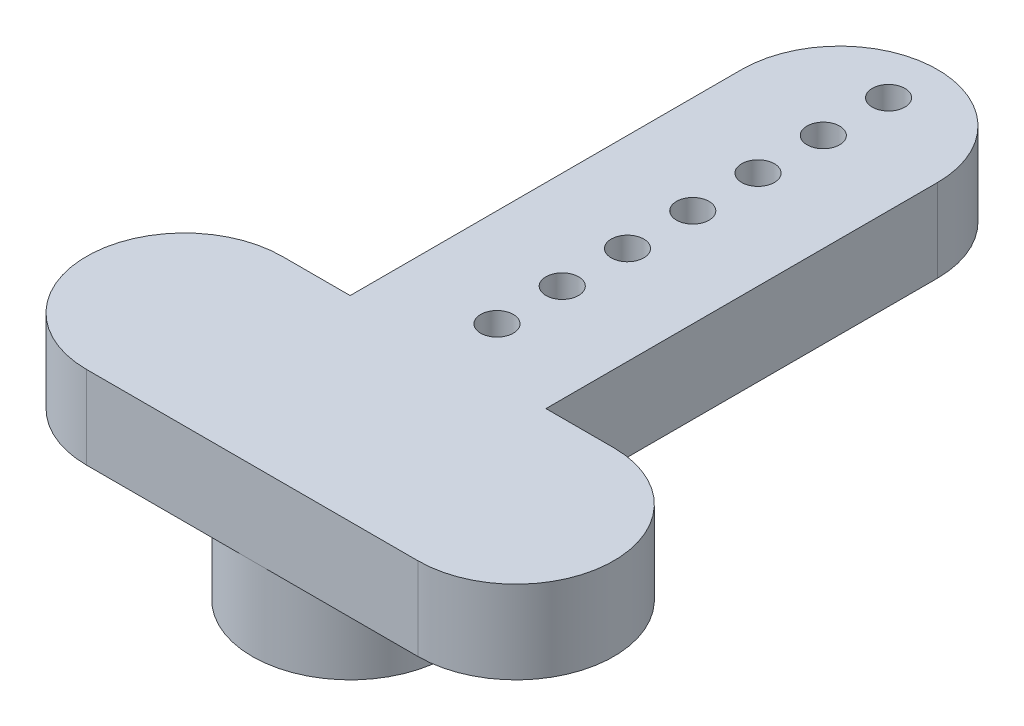
ISO-10303-21;
HEADER;
FILE_DESCRIPTION(('STEP AP214'),'2;1');
FILE_NAME('part.step','',(''),(''),'','','');
FILE_SCHEMA(('AUTOMOTIVE_DESIGN { 1 0 10303 214 1 1 1 1 }'));
ENDSEC;
DATA;
#1=APPLICATION_CONTEXT('core data for automotive mechanical design processes');
#2=APPLICATION_PROTOCOL_DEFINITION('international standard','automotive_design',2000,#1);
#3=PRODUCT_CONTEXT('',#1,'mechanical');
#4=PRODUCT('Part','Part','',(#3));
#5=PRODUCT_RELATED_PRODUCT_CATEGORY('part','',(#4));
#6=PRODUCT_DEFINITION_FORMATION('','',#4);
#7=PRODUCT_DEFINITION_CONTEXT('part definition',#1,'design');
#8=PRODUCT_DEFINITION('design','',#6,#7);
#9=PRODUCT_DEFINITION_SHAPE('','',#8);
#10=(LENGTH_UNIT() NAMED_UNIT(*) SI_UNIT(.MILLI.,.METRE.));
#11=(NAMED_UNIT(*) PLANE_ANGLE_UNIT() SI_UNIT($,.RADIAN.));
#12=(NAMED_UNIT(*) SI_UNIT($,.STERADIAN.) SOLID_ANGLE_UNIT());
#13=UNCERTAINTY_MEASURE_WITH_UNIT(LENGTH_MEASURE(1.E-05),#10,'distance_accuracy_value','');
#14=(GEOMETRIC_REPRESENTATION_CONTEXT(3) GLOBAL_UNCERTAINTY_ASSIGNED_CONTEXT((#13)) GLOBAL_UNIT_ASSIGNED_CONTEXT((#10,
#11,#12)) REPRESENTATION_CONTEXT('',''));
#15=CARTESIAN_POINT('',(0.,0.,0.));
#16=DIRECTION('',(0.,0.,1.));
#17=DIRECTION('',(1.,0.,0.));
#18=AXIS2_PLACEMENT_3D('',#15,#16,#17);
#19=CARTESIAN_POINT('',(0.,2.54,0.));
#20=DIRECTION('',(0.,-1.,0.));
#21=DIRECTION('',(0.,0.,-1.));
#22=AXIS2_PLACEMENT_3D('',#19,#20,#21);
#23=CYLINDRICAL_SURFACE('',#22,3.);
#24=CARTESIAN_POINT('',(0.,2.54,0.));
#25=DIRECTION('',(0.,1.,0.));
#26=DIRECTION('',(0.,0.,1.));
#27=AXIS2_PLACEMENT_3D('',#24,#25,#26);
#28=CIRCLE('',#27,3.);
#29=CARTESIAN_POINT('',(0.,2.54,3.));
#30=VERTEX_POINT('',#29);
#31=EDGE_CURVE('E11',#30,#30,#28,.T.);
#32=ORIENTED_EDGE('',*,*,#31,.F.);
#33=EDGE_LOOP('',(#32));
#34=FACE_BOUND('',#33,.T.);
#35=CARTESIAN_POINT('',(0.,0.,0.));
#36=DIRECTION('',(0.,1.,0.));
#37=DIRECTION('',(0.,0.,1.));
#38=AXIS2_PLACEMENT_3D('',#35,#36,#37);
#39=CIRCLE('',#38,3.);
#40=CARTESIAN_POINT('',(0.,0.,3.));
#41=VERTEX_POINT('',#40);
#42=EDGE_CURVE('E50',#41,#41,#39,.T.);
#43=ORIENTED_EDGE('',*,*,#42,.T.);
#44=EDGE_LOOP('',(#43));
#45=FACE_BOUND('',#44,.T.);
#46=ADVANCED_FACE('F47',(#34,#45),#23,.T.);
#47=CARTESIAN_POINT('',(0.,0.,0.));
#48=DIRECTION('',(0.,1.,0.));
#49=DIRECTION('',(0.,0.,1.));
#50=AXIS2_PLACEMENT_3D('',#47,#48,#49);
#51=PLANE('',#50);
#52=ORIENTED_EDGE('',*,*,#42,.F.);
#53=EDGE_LOOP('',(#52));
#54=FACE_BOUND('',#53,.T.);
#55=ADVANCED_FACE('F207',(#54),#51,.F.);
#56=CARTESIAN_POINT('',(0.,2.54,0.));
#57=DIRECTION('',(0.,1.,0.));
#58=DIRECTION('',(0.,0.,1.));
#59=AXIS2_PLACEMENT_3D('',#56,#57,#58);
#60=PLANE('',#59);
#61=CARTESIAN_POINT('',(0.,2.54,-16.5));
#62=DIRECTION('',(0.,1.,0.));
#63=DIRECTION('',(0.,0.,1.));
#64=AXIS2_PLACEMENT_3D('',#61,#62,#63);
#65=CIRCLE('',#64,0.5);
#66=CARTESIAN_POINT('',(0.,2.54,-16.));
#67=VERTEX_POINT('',#66);
#68=EDGE_CURVE('E157',#67,#67,#65,.T.);
#69=ORIENTED_EDGE('',*,*,#68,.T.);
#70=EDGE_LOOP('',(#69));
#71=FACE_BOUND('',#70,.T.);
#72=CARTESIAN_POINT('',(0.,2.54,-14.5));
#73=DIRECTION('',(0.,1.,0.));
#74=DIRECTION('',(0.,0.,1.));
#75=AXIS2_PLACEMENT_3D('',#72,#73,#74);
#76=CIRCLE('',#75,0.5);
#77=CARTESIAN_POINT('',(0.,2.54,-14.));
#78=VERTEX_POINT('',#77);
#79=EDGE_CURVE('E281',#78,#78,#76,.T.);
#80=ORIENTED_EDGE('',*,*,#79,.T.);
#81=EDGE_LOOP('',(#80));
#82=FACE_BOUND('',#81,.T.);
#83=CARTESIAN_POINT('',(0.,2.54,-12.5));
#84=DIRECTION('',(0.,1.,0.));
#85=DIRECTION('',(0.,0.,1.));
#86=AXIS2_PLACEMENT_3D('',#83,#84,#85);
#87=CIRCLE('',#86,0.5);
#88=CARTESIAN_POINT('',(0.,2.54,-12.));
#89=VERTEX_POINT('',#88);
#90=EDGE_CURVE('E285',#89,#89,#87,.T.);
#91=ORIENTED_EDGE('',*,*,#90,.T.);
#92=EDGE_LOOP('',(#91));
#93=FACE_BOUND('',#92,.T.);
#94=CARTESIAN_POINT('',(0.,2.54,-10.5));
#95=DIRECTION('',(0.,1.,0.));
#96=DIRECTION('',(0.,0.,1.));
#97=AXIS2_PLACEMENT_3D('',#94,#95,#96);
#98=CIRCLE('',#97,0.5);
#99=CARTESIAN_POINT('',(0.,2.54,-10.));
#100=VERTEX_POINT('',#99);
#101=EDGE_CURVE('E313',#100,#100,#98,.T.);
#102=ORIENTED_EDGE('',*,*,#101,.T.);
#103=EDGE_LOOP('',(#102));
#104=FACE_BOUND('',#103,.T.);
#105=CARTESIAN_POINT('',(0.,2.54,-8.5));
#106=DIRECTION('',(0.,1.,0.));
#107=DIRECTION('',(0.,0.,1.));
#108=AXIS2_PLACEMENT_3D('',#105,#106,#107);
#109=CIRCLE('',#108,0.5);
#110=CARTESIAN_POINT('',(0.,2.54,-8.));
#111=VERTEX_POINT('',#110);
#112=EDGE_CURVE('E317',#111,#111,#109,.T.);
#113=ORIENTED_EDGE('',*,*,#112,.T.);
#114=EDGE_LOOP('',(#113));
#115=FACE_BOUND('',#114,.T.);
#116=CARTESIAN_POINT('',(0.,2.54,-6.5));
#117=DIRECTION('',(0.,1.,0.));
#118=DIRECTION('',(0.,0.,1.));
#119=AXIS2_PLACEMENT_3D('',#116,#117,#118);
#120=CIRCLE('',#119,0.5);
#121=CARTESIAN_POINT('',(0.,2.54,-6.));
#122=VERTEX_POINT('',#121);
#123=EDGE_CURVE('E321',#122,#122,#120,.T.);
#124=ORIENTED_EDGE('',*,*,#123,.T.);
#125=EDGE_LOOP('',(#124));
#126=FACE_BOUND('',#125,.T.);
#127=CARTESIAN_POINT('',(0.,2.54,-4.5));
#128=DIRECTION('',(0.,1.,0.));
#129=DIRECTION('',(0.,0.,1.));
#130=AXIS2_PLACEMENT_3D('',#127,#128,#129);
#131=CIRCLE('',#130,0.5);
#132=CARTESIAN_POINT('',(0.,2.54,-4.));
#133=VERTEX_POINT('',#132);
#134=EDGE_CURVE('E325',#133,#133,#131,.T.);
#135=ORIENTED_EDGE('',*,*,#134,.T.);
#136=EDGE_LOOP('',(#135));
#137=FACE_BOUND('',#136,.T.);
#138=DIRECTION('',(1.,0.,0.));
#139=VECTOR('',#138,1.);
#140=CARTESIAN_POINT('',(0.,2.54,3.));
#141=LINE('',#140,#139);
#142=CARTESIAN_POINT('',(5.08,2.54,3.));
#143=VERTEX_POINT('',#142);
#144=EDGE_CURVE('E175',#30,#143,#141,.T.);
#145=ORIENTED_EDGE('',*,*,#144,.F.);
#146=ORIENTED_EDGE('',*,*,#31,.T.);
#147=CARTESIAN_POINT('',(-5.08,2.54,3.));
#148=VERTEX_POINT('',#147);
#149=EDGE_CURVE('E176',#148,#30,#141,.T.);
#150=ORIENTED_EDGE('',*,*,#149,.F.);
#151=CARTESIAN_POINT('',(-5.08,2.54,0.));
#152=DIRECTION('',(0.,1.,0.));
#153=DIRECTION('',(0.,0.,1.));
#154=AXIS2_PLACEMENT_3D('',#151,#152,#153);
#155=CIRCLE('',#154,3.);
#156=CARTESIAN_POINT('',(-5.08,2.54,-3.));
#157=VERTEX_POINT('',#156);
#158=EDGE_CURVE('E136',#157,#148,#155,.T.);
#159=ORIENTED_EDGE('',*,*,#158,.F.);
#160=DIRECTION('',(1.,0.,0.));
#161=VECTOR('',#160,1.);
#162=CARTESIAN_POINT('',(0.,2.54,-3.));
#163=LINE('',#162,#161);
#164=CARTESIAN_POINT('',(-3.,2.54,-3.));
#165=VERTEX_POINT('',#164);
#166=EDGE_CURVE('E169',#157,#165,#163,.T.);
#167=ORIENTED_EDGE('',*,*,#166,.T.);
#168=DIRECTION('',(0.,0.,-1.));
#169=VECTOR('',#168,1.);
#170=CARTESIAN_POINT('',(-3.,2.54,0.));
#171=LINE('',#170,#169);
#172=CARTESIAN_POINT('',(-3.,2.54,-15.));
#173=VERTEX_POINT('',#172);
#174=EDGE_CURVE('E165',#165,#173,#171,.T.);
#175=ORIENTED_EDGE('',*,*,#174,.T.);
#176=CARTESIAN_POINT('',(0.,2.54,-15.));
#177=DIRECTION('',(0.,1.,0.));
#178=DIRECTION('',(0.,0.,1.));
#179=AXIS2_PLACEMENT_3D('',#176,#177,#178);
#180=CIRCLE('',#179,3.);
#181=CARTESIAN_POINT('',(3.,2.54,-15.));
#182=VERTEX_POINT('',#181);
#183=EDGE_CURVE('E161',#173,#182,#180,.F.);
#184=ORIENTED_EDGE('',*,*,#183,.T.);
#185=DIRECTION('',(0.,0.,-1.));
#186=VECTOR('',#185,1.);
#187=CARTESIAN_POINT('',(3.,2.54,0.));
#188=LINE('',#187,#186);
#189=CARTESIAN_POINT('',(3.,2.54,-3.));
#190=VERTEX_POINT('',#189);
#191=EDGE_CURVE('E156',#190,#182,#188,.T.);
#192=ORIENTED_EDGE('',*,*,#191,.F.);
#193=DIRECTION('',(1.,0.,0.));
#194=VECTOR('',#193,1.);
#195=CARTESIAN_POINT('',(0.,2.54,-3.));
#196=LINE('',#195,#194);
#197=CARTESIAN_POINT('',(5.08,2.54,-3.));
#198=VERTEX_POINT('',#197);
#199=EDGE_CURVE('E153',#190,#198,#196,.T.);
#200=ORIENTED_EDGE('',*,*,#199,.T.);
#201=CARTESIAN_POINT('',(5.08,2.54,0.));
#202=DIRECTION('',(0.,1.,0.));
#203=DIRECTION('',(0.,0.,1.));
#204=AXIS2_PLACEMENT_3D('',#201,#202,#203);
#205=CIRCLE('',#204,3.);
#206=EDGE_CURVE('E179',#198,#143,#205,.F.);
#207=ORIENTED_EDGE('',*,*,#206,.T.);
#208=EDGE_LOOP('',(#145,#146,#150,#159,#167,#175,#184,#192,#200,#207));
#209=FACE_BOUND('',#208,.T.);
#210=ADVANCED_FACE('F209',(#71,#82,#93,#104,#115,#126,#137,#209),#60,.F.);
#211=CARTESIAN_POINT('',(0.,5.08,-3.));
#212=DIRECTION('',(0.,0.,-1.));
#213=DIRECTION('',(-1.,0.,0.));
#214=AXIS2_PLACEMENT_3D('',#211,#212,#213);
#215=PLANE('',#214);
#216=ORIENTED_EDGE('',*,*,#199,.F.);
#217=DIRECTION('',(0.,-1.,0.));
#218=VECTOR('',#217,1.);
#219=CARTESIAN_POINT('',(3.,5.08,-3.));
#220=LINE('',#219,#218);
#221=CARTESIAN_POINT('',(3.,5.08,-3.));
#222=VERTEX_POINT('',#221);
#223=EDGE_CURVE('E101',#222,#190,#220,.T.);
#224=ORIENTED_EDGE('',*,*,#223,.F.);
#225=DIRECTION('',(1.,0.,0.));
#226=VECTOR('',#225,1.);
#227=CARTESIAN_POINT('',(0.,5.08,-3.));
#228=LINE('',#227,#226);
#229=CARTESIAN_POINT('',(5.08,5.08,-3.));
#230=VERTEX_POINT('',#229);
#231=EDGE_CURVE('E183',#222,#230,#228,.T.);
#232=ORIENTED_EDGE('',*,*,#231,.T.);
#233=DIRECTION('',(0.,-1.,0.));
#234=VECTOR('',#233,1.);
#235=CARTESIAN_POINT('',(5.08,5.08,-3.));
#236=LINE('',#235,#234);
#237=EDGE_CURVE('E66',#230,#198,#236,.T.);
#238=ORIENTED_EDGE('',*,*,#237,.T.);
#239=EDGE_LOOP('',(#216,#224,#232,#238));
#240=FACE_BOUND('',#239,.T.);
#241=ADVANCED_FACE('F214',(#240),#215,.T.);
#242=CARTESIAN_POINT('',(3.,5.08,0.));
#243=DIRECTION('',(-1.,0.,0.));
#244=DIRECTION('',(0.,0.,1.));
#245=AXIS2_PLACEMENT_3D('',#242,#243,#244);
#246=PLANE('',#245);
#247=ORIENTED_EDGE('',*,*,#191,.T.);
#248=DIRECTION('',(0.,-1.,0.));
#249=VECTOR('',#248,1.);
#250=CARTESIAN_POINT('',(3.,5.08,-15.));
#251=LINE('',#250,#249);
#252=CARTESIAN_POINT('',(3.,5.08,-15.));
#253=VERTEX_POINT('',#252);
#254=EDGE_CURVE('E196',#253,#182,#251,.T.);
#255=ORIENTED_EDGE('',*,*,#254,.F.);
#256=DIRECTION('',(0.,0.,-1.));
#257=VECTOR('',#256,1.);
#258=CARTESIAN_POINT('',(3.,5.08,0.));
#259=LINE('',#258,#257);
#260=EDGE_CURVE('E291',#222,#253,#259,.T.);
#261=ORIENTED_EDGE('',*,*,#260,.F.);
#262=ORIENTED_EDGE('',*,*,#223,.T.);
#263=EDGE_LOOP('',(#247,#255,#261,#262));
#264=FACE_BOUND('',#263,.T.);
#265=ADVANCED_FACE('F220',(#264),#246,.F.);
#266=CARTESIAN_POINT('',(0.,5.08,-15.));
#267=DIRECTION('',(0.,-1.,0.));
#268=DIRECTION('',(0.,0.,-1.));
#269=AXIS2_PLACEMENT_3D('',#266,#267,#268);
#270=CYLINDRICAL_SURFACE('',#269,3.);
#271=ORIENTED_EDGE('',*,*,#183,.F.);
#272=DIRECTION('',(0.,-1.,0.));
#273=VECTOR('',#272,1.);
#274=CARTESIAN_POINT('',(-3.,5.08,-15.));
#275=LINE('',#274,#273);
#276=CARTESIAN_POINT('',(-3.,5.08,-15.));
#277=VERTEX_POINT('',#276);
#278=EDGE_CURVE('E193',#277,#173,#275,.T.);
#279=ORIENTED_EDGE('',*,*,#278,.F.);
#280=CARTESIAN_POINT('',(0.,5.08,-15.));
#281=DIRECTION('',(0.,1.,0.));
#282=DIRECTION('',(0.,0.,1.));
#283=AXIS2_PLACEMENT_3D('',#280,#281,#282);
#284=CIRCLE('',#283,3.);
#285=EDGE_CURVE('E294',#277,#253,#284,.F.);
#286=ORIENTED_EDGE('',*,*,#285,.T.);
#287=ORIENTED_EDGE('',*,*,#254,.T.);
#288=EDGE_LOOP('',(#271,#279,#286,#287));
#289=FACE_BOUND('',#288,.T.);
#290=ADVANCED_FACE('F223',(#289),#270,.T.);
#291=CARTESIAN_POINT('',(-3.,5.08,0.));
#292=DIRECTION('',(-1.,0.,0.));
#293=DIRECTION('',(0.,0.,1.));
#294=AXIS2_PLACEMENT_3D('',#291,#292,#293);
#295=PLANE('',#294);
#296=ORIENTED_EDGE('',*,*,#174,.F.);
#297=DIRECTION('',(0.,-1.,0.));
#298=VECTOR('',#297,1.);
#299=CARTESIAN_POINT('',(-3.,5.08,-3.));
#300=LINE('',#299,#298);
#301=CARTESIAN_POINT('',(-3.,5.08,-3.));
#302=VERTEX_POINT('',#301);
#303=EDGE_CURVE('E190',#302,#165,#300,.T.);
#304=ORIENTED_EDGE('',*,*,#303,.F.);
#305=DIRECTION('',(0.,0.,-1.));
#306=VECTOR('',#305,1.);
#307=CARTESIAN_POINT('',(-3.,5.08,0.));
#308=LINE('',#307,#306);
#309=EDGE_CURVE('E298',#302,#277,#308,.T.);
#310=ORIENTED_EDGE('',*,*,#309,.T.);
#311=ORIENTED_EDGE('',*,*,#278,.T.);
#312=EDGE_LOOP('',(#296,#304,#310,#311));
#313=FACE_BOUND('',#312,.T.);
#314=ADVANCED_FACE('F226',(#313),#295,.T.);
#315=CARTESIAN_POINT('',(0.,5.08,-3.));
#316=DIRECTION('',(0.,0.,-1.));
#317=DIRECTION('',(-1.,0.,0.));
#318=AXIS2_PLACEMENT_3D('',#315,#316,#317);
#319=PLANE('',#318);
#320=ORIENTED_EDGE('',*,*,#166,.F.);
#321=DIRECTION('',(0.,-1.,0.));
#322=VECTOR('',#321,1.);
#323=CARTESIAN_POINT('',(-5.08,5.08,-3.));
#324=LINE('',#323,#322);
#325=CARTESIAN_POINT('',(-5.08,5.08,-3.));
#326=VERTEX_POINT('',#325);
#327=EDGE_CURVE('E141',#326,#157,#324,.T.);
#328=ORIENTED_EDGE('',*,*,#327,.F.);
#329=DIRECTION('',(1.,0.,0.));
#330=VECTOR('',#329,1.);
#331=CARTESIAN_POINT('',(0.,5.08,-3.));
#332=LINE('',#331,#330);
#333=EDGE_CURVE('E128',#326,#302,#332,.T.);
#334=ORIENTED_EDGE('',*,*,#333,.T.);
#335=ORIENTED_EDGE('',*,*,#303,.T.);
#336=EDGE_LOOP('',(#320,#328,#334,#335));
#337=FACE_BOUND('',#336,.T.);
#338=ADVANCED_FACE('F230',(#337),#319,.T.);
#339=CARTESIAN_POINT('',(-5.08,5.08,0.));
#340=DIRECTION('',(0.,-1.,0.));
#341=DIRECTION('',(0.,0.,-1.));
#342=AXIS2_PLACEMENT_3D('',#339,#340,#341);
#343=CYLINDRICAL_SURFACE('',#342,3.);
#344=ORIENTED_EDGE('',*,*,#158,.T.);
#345=DIRECTION('',(0.,-1.,0.));
#346=VECTOR('',#345,1.);
#347=CARTESIAN_POINT('',(-5.08,5.08,3.));
#348=LINE('',#347,#346);
#349=CARTESIAN_POINT('',(-5.08,5.08,3.));
#350=VERTEX_POINT('',#349);
#351=EDGE_CURVE('E133',#350,#148,#348,.T.);
#352=ORIENTED_EDGE('',*,*,#351,.F.);
#353=CARTESIAN_POINT('',(-5.08,5.08,0.));
#354=DIRECTION('',(0.,1.,0.));
#355=DIRECTION('',(0.,0.,1.));
#356=AXIS2_PLACEMENT_3D('',#353,#354,#355);
#357=CIRCLE('',#356,3.);
#358=EDGE_CURVE('E118',#326,#350,#357,.T.);
#359=ORIENTED_EDGE('',*,*,#358,.F.);
#360=ORIENTED_EDGE('',*,*,#327,.T.);
#361=EDGE_LOOP('',(#344,#352,#359,#360));
#362=FACE_BOUND('',#361,.T.);
#363=ADVANCED_FACE('F134',(#362),#343,.T.);
#364=CARTESIAN_POINT('',(0.,5.08,3.));
#365=DIRECTION('',(0.,0.,-1.));
#366=DIRECTION('',(-1.,0.,0.));
#367=AXIS2_PLACEMENT_3D('',#364,#365,#366);
#368=PLANE('',#367);
#369=ORIENTED_EDGE('',*,*,#149,.T.);
#370=ORIENTED_EDGE('',*,*,#144,.T.);
#371=DIRECTION('',(0.,-1.,0.));
#372=VECTOR('',#371,1.);
#373=CARTESIAN_POINT('',(5.08,5.08,3.));
#374=LINE('',#373,#372);
#375=CARTESIAN_POINT('',(5.08,5.08,3.));
#376=VERTEX_POINT('',#375);
#377=EDGE_CURVE('E142',#376,#143,#374,.T.);
#378=ORIENTED_EDGE('',*,*,#377,.F.);
#379=DIRECTION('',(1.,0.,0.));
#380=VECTOR('',#379,1.);
#381=CARTESIAN_POINT('',(0.,5.08,3.));
#382=LINE('',#381,#380);
#383=EDGE_CURVE('E124',#350,#376,#382,.T.);
#384=ORIENTED_EDGE('',*,*,#383,.F.);
#385=ORIENTED_EDGE('',*,*,#351,.T.);
#386=EDGE_LOOP('',(#369,#370,#378,#384,#385));
#387=FACE_BOUND('',#386,.T.);
#388=ADVANCED_FACE('F144',(#387),#368,.F.);
#389=CARTESIAN_POINT('',(5.08,5.08,0.));
#390=DIRECTION('',(0.,-1.,0.));
#391=DIRECTION('',(0.,0.,-1.));
#392=AXIS2_PLACEMENT_3D('',#389,#390,#391);
#393=CYLINDRICAL_SURFACE('',#392,3.);
#394=ORIENTED_EDGE('',*,*,#206,.F.);
#395=ORIENTED_EDGE('',*,*,#237,.F.);
#396=CARTESIAN_POINT('',(5.08,5.08,0.));
#397=DIRECTION('',(0.,1.,0.));
#398=DIRECTION('',(0.,0.,1.));
#399=AXIS2_PLACEMENT_3D('',#396,#397,#398);
#400=CIRCLE('',#399,3.);
#401=EDGE_CURVE('E147',#230,#376,#400,.F.);
#402=ORIENTED_EDGE('',*,*,#401,.T.);
#403=ORIENTED_EDGE('',*,*,#377,.T.);
#404=EDGE_LOOP('',(#394,#395,#402,#403));
#405=FACE_BOUND('',#404,.T.);
#406=ADVANCED_FACE('F239',(#405),#393,.T.);
#407=CARTESIAN_POINT('',(0.,5.08,0.));
#408=DIRECTION('',(0.,1.,0.));
#409=DIRECTION('',(0.,0.,1.));
#410=AXIS2_PLACEMENT_3D('',#407,#408,#409);
#411=PLANE('',#410);
#412=CARTESIAN_POINT('',(0.,5.08,-16.5));
#413=DIRECTION('',(0.,1.,0.));
#414=DIRECTION('',(0.,0.,1.));
#415=AXIS2_PLACEMENT_3D('',#412,#413,#414);
#416=CIRCLE('',#415,0.5);
#417=CARTESIAN_POINT('',(0.,5.08,-16.));
#418=VERTEX_POINT('',#417);
#419=EDGE_CURVE('E277',#418,#418,#416,.T.);
#420=ORIENTED_EDGE('',*,*,#419,.F.);
#421=EDGE_LOOP('',(#420));
#422=FACE_BOUND('',#421,.T.);
#423=CARTESIAN_POINT('',(0.,5.08,-14.5));
#424=DIRECTION('',(0.,1.,0.));
#425=DIRECTION('',(0.,0.,1.));
#426=AXIS2_PLACEMENT_3D('',#423,#424,#425);
#427=CIRCLE('',#426,0.5);
#428=CARTESIAN_POINT('',(0.,5.08,-14.));
#429=VERTEX_POINT('',#428);
#430=EDGE_CURVE('E349',#429,#429,#427,.T.);
#431=ORIENTED_EDGE('',*,*,#430,.F.);
#432=EDGE_LOOP('',(#431));
#433=FACE_BOUND('',#432,.T.);
#434=CARTESIAN_POINT('',(0.,5.08,-12.5));
#435=DIRECTION('',(0.,1.,0.));
#436=DIRECTION('',(0.,0.,1.));
#437=AXIS2_PLACEMENT_3D('',#434,#435,#436);
#438=CIRCLE('',#437,0.5);
#439=CARTESIAN_POINT('',(0.,5.08,-12.));
#440=VERTEX_POINT('',#439);
#441=EDGE_CURVE('E345',#440,#440,#438,.T.);
#442=ORIENTED_EDGE('',*,*,#441,.F.);
#443=EDGE_LOOP('',(#442));
#444=FACE_BOUND('',#443,.T.);
#445=CARTESIAN_POINT('',(0.,5.08,-10.5));
#446=DIRECTION('',(0.,1.,0.));
#447=DIRECTION('',(0.,0.,1.));
#448=AXIS2_PLACEMENT_3D('',#445,#446,#447);
#449=CIRCLE('',#448,0.5);
#450=CARTESIAN_POINT('',(0.,5.08,-10.));
#451=VERTEX_POINT('',#450);
#452=EDGE_CURVE('E341',#451,#451,#449,.T.);
#453=ORIENTED_EDGE('',*,*,#452,.F.);
#454=EDGE_LOOP('',(#453));
#455=FACE_BOUND('',#454,.T.);
#456=CARTESIAN_POINT('',(0.,5.08,-8.5));
#457=DIRECTION('',(0.,1.,0.));
#458=DIRECTION('',(0.,0.,1.));
#459=AXIS2_PLACEMENT_3D('',#456,#457,#458);
#460=CIRCLE('',#459,0.5);
#461=CARTESIAN_POINT('',(0.,5.08,-8.));
#462=VERTEX_POINT('',#461);
#463=EDGE_CURVE('E337',#462,#462,#460,.T.);
#464=ORIENTED_EDGE('',*,*,#463,.F.);
#465=EDGE_LOOP('',(#464));
#466=FACE_BOUND('',#465,.T.);
#467=CARTESIAN_POINT('',(0.,5.08,-6.5));
#468=DIRECTION('',(0.,1.,0.));
#469=DIRECTION('',(0.,0.,1.));
#470=AXIS2_PLACEMENT_3D('',#467,#468,#469);
#471=CIRCLE('',#470,0.5);
#472=CARTESIAN_POINT('',(0.,5.08,-6.));
#473=VERTEX_POINT('',#472);
#474=EDGE_CURVE('E333',#473,#473,#471,.T.);
#475=ORIENTED_EDGE('',*,*,#474,.F.);
#476=EDGE_LOOP('',(#475));
#477=FACE_BOUND('',#476,.T.);
#478=CARTESIAN_POINT('',(0.,5.08,-4.5));
#479=DIRECTION('',(0.,1.,0.));
#480=DIRECTION('',(0.,0.,1.));
#481=AXIS2_PLACEMENT_3D('',#478,#479,#480);
#482=CIRCLE('',#481,0.5);
#483=CARTESIAN_POINT('',(0.,5.08,-4.));
#484=VERTEX_POINT('',#483);
#485=EDGE_CURVE('E329',#484,#484,#482,.T.);
#486=ORIENTED_EDGE('',*,*,#485,.F.);
#487=EDGE_LOOP('',(#486));
#488=FACE_BOUND('',#487,.T.);
#489=ORIENTED_EDGE('',*,*,#231,.F.);
#490=ORIENTED_EDGE('',*,*,#260,.T.);
#491=ORIENTED_EDGE('',*,*,#285,.F.);
#492=ORIENTED_EDGE('',*,*,#309,.F.);
#493=ORIENTED_EDGE('',*,*,#333,.F.);
#494=ORIENTED_EDGE('',*,*,#358,.T.);
#495=ORIENTED_EDGE('',*,*,#383,.T.);
#496=ORIENTED_EDGE('',*,*,#401,.F.);
#497=EDGE_LOOP('',(#489,#490,#491,#492,#493,#494,#495,#496));
#498=FACE_BOUND('',#497,.T.);
#499=ADVANCED_FACE('F121',(#422,#433,#444,#455,#466,#477,#488,#498),#411,.T.);
#500=CARTESIAN_POINT('',(0.,-4.92,-4.5));
#501=DIRECTION('',(0.,1.,0.));
#502=DIRECTION('',(0.,0.,1.));
#503=AXIS2_PLACEMENT_3D('',#500,#501,#502);
#504=CYLINDRICAL_SURFACE('',#503,0.5);
#505=ORIENTED_EDGE('',*,*,#485,.T.);
#506=EDGE_LOOP('',(#505));
#507=FACE_BOUND('',#506,.T.);
#508=ORIENTED_EDGE('',*,*,#134,.F.);
#509=EDGE_LOOP('',(#508));
#510=FACE_BOUND('',#509,.T.);
#511=ADVANCED_FACE('F244',(#507,#510),#504,.F.);
#512=CARTESIAN_POINT('',(0.,-4.92,-6.5));
#513=DIRECTION('',(0.,1.,0.));
#514=DIRECTION('',(0.,0.,1.));
#515=AXIS2_PLACEMENT_3D('',#512,#513,#514);
#516=CYLINDRICAL_SURFACE('',#515,0.5);
#517=ORIENTED_EDGE('',*,*,#474,.T.);
#518=EDGE_LOOP('',(#517));
#519=FACE_BOUND('',#518,.T.);
#520=ORIENTED_EDGE('',*,*,#123,.F.);
#521=EDGE_LOOP('',(#520));
#522=FACE_BOUND('',#521,.T.);
#523=ADVANCED_FACE('F248',(#519,#522),#516,.F.);
#524=CARTESIAN_POINT('',(0.,-4.92,-8.5));
#525=DIRECTION('',(0.,1.,0.));
#526=DIRECTION('',(0.,0.,1.));
#527=AXIS2_PLACEMENT_3D('',#524,#525,#526);
#528=CYLINDRICAL_SURFACE('',#527,0.5);
#529=ORIENTED_EDGE('',*,*,#463,.T.);
#530=EDGE_LOOP('',(#529));
#531=FACE_BOUND('',#530,.T.);
#532=ORIENTED_EDGE('',*,*,#112,.F.);
#533=EDGE_LOOP('',(#532));
#534=FACE_BOUND('',#533,.T.);
#535=ADVANCED_FACE('F252',(#531,#534),#528,.F.);
#536=CARTESIAN_POINT('',(0.,-4.92,-10.5));
#537=DIRECTION('',(0.,1.,0.));
#538=DIRECTION('',(0.,0.,1.));
#539=AXIS2_PLACEMENT_3D('',#536,#537,#538);
#540=CYLINDRICAL_SURFACE('',#539,0.5);
#541=ORIENTED_EDGE('',*,*,#452,.T.);
#542=EDGE_LOOP('',(#541));
#543=FACE_BOUND('',#542,.T.);
#544=ORIENTED_EDGE('',*,*,#101,.F.);
#545=EDGE_LOOP('',(#544));
#546=FACE_BOUND('',#545,.T.);
#547=ADVANCED_FACE('F256',(#543,#546),#540,.F.);
#548=CARTESIAN_POINT('',(0.,-4.92,-12.5));
#549=DIRECTION('',(0.,1.,0.));
#550=DIRECTION('',(0.,0.,1.));
#551=AXIS2_PLACEMENT_3D('',#548,#549,#550);
#552=CYLINDRICAL_SURFACE('',#551,0.5);
#553=ORIENTED_EDGE('',*,*,#441,.T.);
#554=EDGE_LOOP('',(#553));
#555=FACE_BOUND('',#554,.T.);
#556=ORIENTED_EDGE('',*,*,#90,.F.);
#557=EDGE_LOOP('',(#556));
#558=FACE_BOUND('',#557,.T.);
#559=ADVANCED_FACE('F260',(#555,#558),#552,.F.);
#560=CARTESIAN_POINT('',(0.,-4.92,-14.5));
#561=DIRECTION('',(0.,1.,0.));
#562=DIRECTION('',(0.,0.,1.));
#563=AXIS2_PLACEMENT_3D('',#560,#561,#562);
#564=CYLINDRICAL_SURFACE('',#563,0.5);
#565=ORIENTED_EDGE('',*,*,#430,.T.);
#566=EDGE_LOOP('',(#565));
#567=FACE_BOUND('',#566,.T.);
#568=ORIENTED_EDGE('',*,*,#79,.F.);
#569=EDGE_LOOP('',(#568));
#570=FACE_BOUND('',#569,.T.);
#571=ADVANCED_FACE('F264',(#567,#570),#564,.F.);
#572=CARTESIAN_POINT('',(0.,-4.92,-16.5));
#573=DIRECTION('',(0.,1.,0.));
#574=DIRECTION('',(0.,0.,1.));
#575=AXIS2_PLACEMENT_3D('',#572,#573,#574);
#576=CYLINDRICAL_SURFACE('',#575,0.5);
#577=ORIENTED_EDGE('',*,*,#419,.T.);
#578=EDGE_LOOP('',(#577));
#579=FACE_BOUND('',#578,.T.);
#580=ORIENTED_EDGE('',*,*,#68,.F.);
#581=EDGE_LOOP('',(#580));
#582=FACE_BOUND('',#581,.T.);
#583=ADVANCED_FACE('F268',(#579,#582),#576,.F.);
#584=CLOSED_SHELL('',(#46,#55,#210,#241,#265,#290,#314,#338,#363,#388,#406,#499,#511,#523,#535,
#547,#559,#571,#583));
#585=MANIFOLD_SOLID_BREP('B2',#584);
#586=ADVANCED_BREP_SHAPE_REPRESENTATION('',(#18,#585),#14);
#587=SHAPE_DEFINITION_REPRESENTATION(#9,#586);
ENDSEC;
END-ISO-10303-21;
